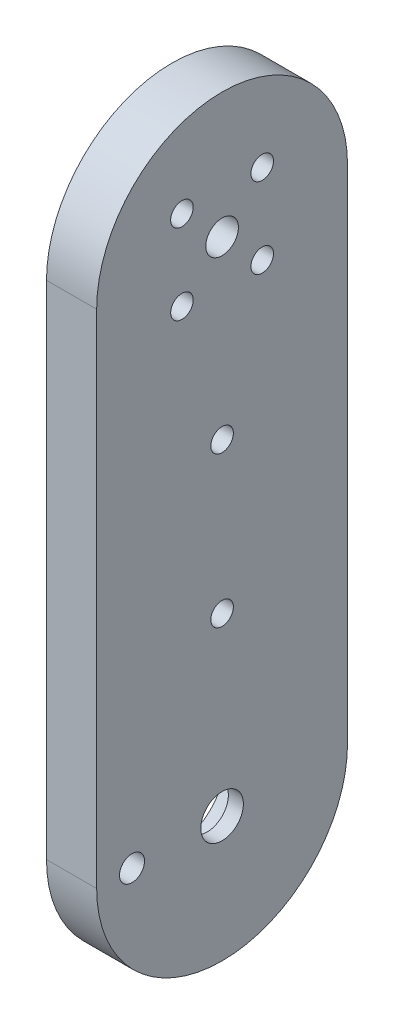
ISO-10303-21;
HEADER;
FILE_DESCRIPTION(('STEP AP214'),'2;1');
FILE_NAME('part.step','',(''),(''),'','','');
FILE_SCHEMA(('AUTOMOTIVE_DESIGN { 1 0 10303 214 1 1 1 1 }'));
ENDSEC;
DATA;
#1=APPLICATION_CONTEXT('core data for automotive mechanical design processes');
#2=APPLICATION_PROTOCOL_DEFINITION('international standard','automotive_design',2000,#1);
#3=PRODUCT_CONTEXT('',#1,'mechanical');
#4=PRODUCT('Part','Part','',(#3));
#5=PRODUCT_RELATED_PRODUCT_CATEGORY('part','',(#4));
#6=PRODUCT_DEFINITION_FORMATION('','',#4);
#7=PRODUCT_DEFINITION_CONTEXT('part definition',#1,'design');
#8=PRODUCT_DEFINITION('design','',#6,#7);
#9=PRODUCT_DEFINITION_SHAPE('','',#8);
#10=(LENGTH_UNIT() NAMED_UNIT(*) SI_UNIT(.MILLI.,.METRE.));
#11=(NAMED_UNIT(*) PLANE_ANGLE_UNIT() SI_UNIT($,.RADIAN.));
#12=(NAMED_UNIT(*) SI_UNIT($,.STERADIAN.) SOLID_ANGLE_UNIT());
#13=UNCERTAINTY_MEASURE_WITH_UNIT(LENGTH_MEASURE(1.E-05),#10,'distance_accuracy_value','');
#14=(GEOMETRIC_REPRESENTATION_CONTEXT(3) GLOBAL_UNCERTAINTY_ASSIGNED_CONTEXT((#13)) GLOBAL_UNIT_ASSIGNED_CONTEXT((#10,
#11,#12)) REPRESENTATION_CONTEXT('',''));
#15=CARTESIAN_POINT('',(0.,0.,0.));
#16=DIRECTION('',(0.,0.,1.));
#17=DIRECTION('',(1.,0.,0.));
#18=AXIS2_PLACEMENT_3D('',#15,#16,#17);
#19=CARTESIAN_POINT('',(10.,0.,0.));
#20=DIRECTION('',(1.,0.,0.));
#21=DIRECTION('',(0.,0.,-1.));
#22=AXIS2_PLACEMENT_3D('',#19,#20,#21);
#23=PLANE('',#22);
#24=CARTESIAN_POINT('',(10.,-100.,17.95));
#25=DIRECTION('',(-1.,0.,0.));
#26=DIRECTION('',(0.,0.,1.));
#27=AXIS2_PLACEMENT_3D('',#24,#25,#26);
#28=CIRCLE('',#27,2.5);
#29=CARTESIAN_POINT('',(10.,-100.,20.45));
#30=VERTEX_POINT('',#29);
#31=EDGE_CURVE('E217',#30,#30,#28,.T.);
#32=ORIENTED_EDGE('',*,*,#31,.T.);
#33=EDGE_LOOP('',(#32));
#34=FACE_BOUND('',#33,.T.);
#35=CARTESIAN_POINT('',(10.,-100.,0.));
#36=DIRECTION('',(-1.,0.,0.));
#37=DIRECTION('',(0.,0.,1.));
#38=AXIS2_PLACEMENT_3D('',#35,#36,#37);
#39=CIRCLE('',#38,4.25);
#40=CARTESIAN_POINT('',(10.,-100.,4.24999999999999));
#41=VERTEX_POINT('',#40);
#42=EDGE_CURVE('E225',#41,#41,#39,.T.);
#43=ORIENTED_EDGE('',*,*,#42,.T.);
#44=EDGE_LOOP('',(#43));
#45=FACE_BOUND('',#44,.T.);
#46=CARTESIAN_POINT('',(10.,-35.,0.));
#47=DIRECTION('',(-1.,0.,0.));
#48=DIRECTION('',(0.,0.,1.));
#49=AXIS2_PLACEMENT_3D('',#46,#47,#48);
#50=CIRCLE('',#49,2.25);
#51=CARTESIAN_POINT('',(10.,-35.,2.25));
#52=VERTEX_POINT('',#51);
#53=EDGE_CURVE('E99',#52,#52,#50,.T.);
#54=ORIENTED_EDGE('',*,*,#53,.T.);
#55=EDGE_LOOP('',(#54));
#56=FACE_BOUND('',#55,.T.);
#57=CARTESIAN_POINT('',(10.,-65.,0.));
#58=DIRECTION('',(-1.,0.,0.));
#59=DIRECTION('',(0.,0.,1.));
#60=AXIS2_PLACEMENT_3D('',#57,#58,#59);
#61=CIRCLE('',#60,2.25);
#62=CARTESIAN_POINT('',(10.,-65.,2.25));
#63=VERTEX_POINT('',#62);
#64=EDGE_CURVE('E234',#63,#63,#61,.T.);
#65=ORIENTED_EDGE('',*,*,#64,.T.);
#66=EDGE_LOOP('',(#65));
#67=FACE_BOUND('',#66,.T.);
#68=CARTESIAN_POINT('',(10.,-8.,-7.99999999999999));
#69=DIRECTION('',(1.,0.,0.));
#70=DIRECTION('',(0.,0.,-1.));
#71=AXIS2_PLACEMENT_3D('',#68,#69,#70);
#72=CIRCLE('',#71,2.25);
#73=CARTESIAN_POINT('',(10.,-8.,-10.25));
#74=VERTEX_POINT('',#73);
#75=EDGE_CURVE('E115',#74,#74,#72,.T.);
#76=ORIENTED_EDGE('',*,*,#75,.F.);
#77=EDGE_LOOP('',(#76));
#78=FACE_BOUND('',#77,.T.);
#79=CARTESIAN_POINT('',(10.,8.,8.00000000000001));
#80=DIRECTION('',(1.,0.,0.));
#81=DIRECTION('',(0.,0.,-1.));
#82=AXIS2_PLACEMENT_3D('',#79,#80,#81);
#83=CIRCLE('',#82,2.25);
#84=CARTESIAN_POINT('',(10.,8.,5.75000000000001));
#85=VERTEX_POINT('',#84);
#86=EDGE_CURVE('E127',#85,#85,#83,.T.);
#87=ORIENTED_EDGE('',*,*,#86,.F.);
#88=EDGE_LOOP('',(#87));
#89=FACE_BOUND('',#88,.T.);
#90=CARTESIAN_POINT('',(10.,0.,0.));
#91=DIRECTION('',(1.,0.,0.));
#92=DIRECTION('',(0.,0.,-1.));
#93=AXIS2_PLACEMENT_3D('',#90,#91,#92);
#94=CIRCLE('',#93,25.);
#95=CARTESIAN_POINT('',(10.,0.,-25.));
#96=VERTEX_POINT('',#95);
#97=CARTESIAN_POINT('',(10.,0.,25.));
#98=VERTEX_POINT('',#97);
#99=EDGE_CURVE('E139',#96,#98,#94,.T.);
#100=ORIENTED_EDGE('',*,*,#99,.T.);
#101=DIRECTION('',(0.,-1.,0.));
#102=VECTOR('',#101,1.);
#103=CARTESIAN_POINT('',(10.,0.,25.));
#104=LINE('',#103,#102);
#105=CARTESIAN_POINT('',(10.,-100.,25.));
#106=VERTEX_POINT('',#105);
#107=EDGE_CURVE('E87',#98,#106,#104,.T.);
#108=ORIENTED_EDGE('',*,*,#107,.T.);
#109=CARTESIAN_POINT('',(10.,-100.,0.));
#110=DIRECTION('',(1.,0.,0.));
#111=DIRECTION('',(0.,0.,-1.));
#112=AXIS2_PLACEMENT_3D('',#109,#110,#111);
#113=CIRCLE('',#112,25.);
#114=CARTESIAN_POINT('',(10.,-100.,-25.));
#115=VERTEX_POINT('',#114);
#116=EDGE_CURVE('E94',#106,#115,#113,.T.);
#117=ORIENTED_EDGE('',*,*,#116,.T.);
#118=DIRECTION('',(0.,1.,0.));
#119=VECTOR('',#118,1.);
#120=CARTESIAN_POINT('',(10.,-85.,-25.));
#121=LINE('',#120,#119);
#122=EDGE_CURVE('E56',#115,#96,#121,.T.);
#123=ORIENTED_EDGE('',*,*,#122,.T.);
#124=EDGE_LOOP('',(#100,#108,#117,#123));
#125=FACE_BOUND('',#124,.T.);
#126=CARTESIAN_POINT('',(10.,0.,0.));
#127=DIRECTION('',(1.,0.,0.));
#128=DIRECTION('',(0.,0.,-1.));
#129=AXIS2_PLACEMENT_3D('',#126,#127,#128);
#130=CIRCLE('',#129,3.25);
#131=CARTESIAN_POINT('',(10.,0.,-3.25));
#132=VERTEX_POINT('',#131);
#133=EDGE_CURVE('E133',#132,#132,#130,.T.);
#134=ORIENTED_EDGE('',*,*,#133,.F.);
#135=EDGE_LOOP('',(#134));
#136=FACE_BOUND('',#135,.T.);
#137=CARTESIAN_POINT('',(10.,8.,-7.99999999999999));
#138=DIRECTION('',(1.,0.,0.));
#139=DIRECTION('',(0.,0.,-1.));
#140=AXIS2_PLACEMENT_3D('',#137,#138,#139);
#141=CIRCLE('',#140,2.25);
#142=CARTESIAN_POINT('',(10.,8.,-10.25));
#143=VERTEX_POINT('',#142);
#144=EDGE_CURVE('E121',#143,#143,#141,.T.);
#145=ORIENTED_EDGE('',*,*,#144,.F.);
#146=EDGE_LOOP('',(#145));
#147=FACE_BOUND('',#146,.T.);
#148=CARTESIAN_POINT('',(10.,-8.,8.00000000000001));
#149=DIRECTION('',(1.,0.,0.));
#150=DIRECTION('',(0.,0.,-1.));
#151=AXIS2_PLACEMENT_3D('',#148,#149,#150);
#152=CIRCLE('',#151,2.25);
#153=CARTESIAN_POINT('',(10.,-8.,5.75000000000001));
#154=VERTEX_POINT('',#153);
#155=EDGE_CURVE('E108',#154,#154,#152,.T.);
#156=ORIENTED_EDGE('',*,*,#155,.F.);
#157=EDGE_LOOP('',(#156));
#158=FACE_BOUND('',#157,.T.);
#159=ADVANCED_FACE('F39',(#34,#45,#56,#67,#78,#89,#125,#136,#147,#158),#23,.T.);
#160=CARTESIAN_POINT('',(0.,0.,0.));
#161=DIRECTION('',(1.,0.,0.));
#162=DIRECTION('',(0.,0.,-1.));
#163=AXIS2_PLACEMENT_3D('',#160,#161,#162);
#164=PLANE('',#163);
#165=CARTESIAN_POINT('',(0.,-100.,17.95));
#166=DIRECTION('',(-1.,0.,0.));
#167=DIRECTION('',(0.,0.,1.));
#168=AXIS2_PLACEMENT_3D('',#165,#166,#167);
#169=CIRCLE('',#168,2.5);
#170=CARTESIAN_POINT('',(0.,-100.,20.45));
#171=VERTEX_POINT('',#170);
#172=EDGE_CURVE('E220',#171,#171,#169,.T.);
#173=ORIENTED_EDGE('',*,*,#172,.F.);
#174=EDGE_LOOP('',(#173));
#175=FACE_BOUND('',#174,.T.);
#176=CARTESIAN_POINT('',(0.,-100.,0.));
#177=DIRECTION('',(-1.,0.,0.));
#178=DIRECTION('',(0.,0.,1.));
#179=AXIS2_PLACEMENT_3D('',#176,#177,#178);
#180=CIRCLE('',#179,10.9);
#181=CARTESIAN_POINT('',(0.,-100.,10.9));
#182=VERTEX_POINT('',#181);
#183=EDGE_CURVE('E228',#182,#182,#180,.T.);
#184=ORIENTED_EDGE('',*,*,#183,.F.);
#185=EDGE_LOOP('',(#184));
#186=FACE_BOUND('',#185,.T.);
#187=CARTESIAN_POINT('',(0.,-35.,0.));
#188=DIRECTION('',(-1.,0.,0.));
#189=DIRECTION('',(0.,0.,1.));
#190=AXIS2_PLACEMENT_3D('',#187,#188,#189);
#191=CIRCLE('',#190,2.25);
#192=CARTESIAN_POINT('',(0.,-35.,2.25));
#193=VERTEX_POINT('',#192);
#194=EDGE_CURVE('E102',#193,#193,#191,.T.);
#195=ORIENTED_EDGE('',*,*,#194,.F.);
#196=EDGE_LOOP('',(#195));
#197=FACE_BOUND('',#196,.T.);
#198=CARTESIAN_POINT('',(0.,-65.,0.));
#199=DIRECTION('',(-1.,0.,0.));
#200=DIRECTION('',(0.,0.,1.));
#201=AXIS2_PLACEMENT_3D('',#198,#199,#200);
#202=CIRCLE('',#201,2.25);
#203=CARTESIAN_POINT('',(0.,-65.,2.25));
#204=VERTEX_POINT('',#203);
#205=EDGE_CURVE('E239',#204,#204,#202,.T.);
#206=ORIENTED_EDGE('',*,*,#205,.F.);
#207=EDGE_LOOP('',(#206));
#208=FACE_BOUND('',#207,.T.);
#209=CARTESIAN_POINT('',(0.,0.,0.));
#210=DIRECTION('',(1.,0.,0.));
#211=DIRECTION('',(0.,0.,-1.));
#212=AXIS2_PLACEMENT_3D('',#209,#210,#211);
#213=CIRCLE('',#212,25.);
#214=CARTESIAN_POINT('',(0.,0.,-25.));
#215=VERTEX_POINT('',#214);
#216=CARTESIAN_POINT('',(0.,0.,25.));
#217=VERTEX_POINT('',#216);
#218=EDGE_CURVE('E136',#215,#217,#213,.T.);
#219=ORIENTED_EDGE('',*,*,#218,.F.);
#220=DIRECTION('',(0.,1.,0.));
#221=VECTOR('',#220,1.);
#222=CARTESIAN_POINT('',(0.,-85.,-25.));
#223=LINE('',#222,#221);
#224=CARTESIAN_POINT('',(0.,-100.,-25.));
#225=VERTEX_POINT('',#224);
#226=EDGE_CURVE('E141',#225,#215,#223,.T.);
#227=ORIENTED_EDGE('',*,*,#226,.F.);
#228=CARTESIAN_POINT('',(0.,-100.,0.));
#229=DIRECTION('',(1.,0.,0.));
#230=DIRECTION('',(0.,0.,-1.));
#231=AXIS2_PLACEMENT_3D('',#228,#229,#230);
#232=CIRCLE('',#231,25.);
#233=CARTESIAN_POINT('',(0.,-100.,25.));
#234=VERTEX_POINT('',#233);
#235=EDGE_CURVE('E95',#225,#234,#232,.F.);
#236=ORIENTED_EDGE('',*,*,#235,.T.);
#237=DIRECTION('',(0.,-1.,0.));
#238=VECTOR('',#237,1.);
#239=CARTESIAN_POINT('',(0.,0.,25.));
#240=LINE('',#239,#238);
#241=EDGE_CURVE('E68',#217,#234,#240,.T.);
#242=ORIENTED_EDGE('',*,*,#241,.F.);
#243=EDGE_LOOP('',(#219,#227,#236,#242));
#244=FACE_BOUND('',#243,.T.);
#245=CARTESIAN_POINT('',(0.,0.,0.));
#246=DIRECTION('',(1.,0.,0.));
#247=DIRECTION('',(0.,0.,-1.));
#248=AXIS2_PLACEMENT_3D('',#245,#246,#247);
#249=CIRCLE('',#248,3.25);
#250=CARTESIAN_POINT('',(0.,0.,-3.25));
#251=VERTEX_POINT('',#250);
#252=EDGE_CURVE('E130',#251,#251,#249,.T.);
#253=ORIENTED_EDGE('',*,*,#252,.T.);
#254=EDGE_LOOP('',(#253));
#255=FACE_BOUND('',#254,.T.);
#256=CARTESIAN_POINT('',(0.,8.,8.00000000000001));
#257=DIRECTION('',(1.,0.,0.));
#258=DIRECTION('',(0.,0.,-1.));
#259=AXIS2_PLACEMENT_3D('',#256,#257,#258);
#260=CIRCLE('',#259,2.25);
#261=CARTESIAN_POINT('',(0.,8.,5.75000000000001));
#262=VERTEX_POINT('',#261);
#263=EDGE_CURVE('E124',#262,#262,#260,.T.);
#264=ORIENTED_EDGE('',*,*,#263,.T.);
#265=EDGE_LOOP('',(#264));
#266=FACE_BOUND('',#265,.T.);
#267=CARTESIAN_POINT('',(0.,8.,-7.99999999999999));
#268=DIRECTION('',(1.,0.,0.));
#269=DIRECTION('',(0.,0.,-1.));
#270=AXIS2_PLACEMENT_3D('',#267,#268,#269);
#271=CIRCLE('',#270,2.25);
#272=CARTESIAN_POINT('',(0.,8.,-10.25));
#273=VERTEX_POINT('',#272);
#274=EDGE_CURVE('E118',#273,#273,#271,.T.);
#275=ORIENTED_EDGE('',*,*,#274,.T.);
#276=EDGE_LOOP('',(#275));
#277=FACE_BOUND('',#276,.T.);
#278=CARTESIAN_POINT('',(0.,-8.,-7.99999999999999));
#279=DIRECTION('',(1.,0.,0.));
#280=DIRECTION('',(0.,0.,-1.));
#281=AXIS2_PLACEMENT_3D('',#278,#279,#280);
#282=CIRCLE('',#281,2.25);
#283=CARTESIAN_POINT('',(0.,-8.,-10.25));
#284=VERTEX_POINT('',#283);
#285=EDGE_CURVE('E111',#284,#284,#282,.T.);
#286=ORIENTED_EDGE('',*,*,#285,.T.);
#287=EDGE_LOOP('',(#286));
#288=FACE_BOUND('',#287,.T.);
#289=CARTESIAN_POINT('',(0.,-8.,8.00000000000001));
#290=DIRECTION('',(1.,0.,0.));
#291=DIRECTION('',(0.,0.,-1.));
#292=AXIS2_PLACEMENT_3D('',#289,#290,#291);
#293=CIRCLE('',#292,2.25);
#294=CARTESIAN_POINT('',(0.,-8.,5.75000000000001));
#295=VERTEX_POINT('',#294);
#296=EDGE_CURVE('E112',#295,#295,#293,.T.);
#297=ORIENTED_EDGE('',*,*,#296,.T.);
#298=EDGE_LOOP('',(#297));
#299=FACE_BOUND('',#298,.T.);
#300=ADVANCED_FACE('F148',(#175,#186,#197,#208,#244,#255,#266,#277,#288,#299),#164,.F.);
#301=CARTESIAN_POINT('',(10.,0.,0.));
#302=DIRECTION('',(-1.,0.,0.));
#303=DIRECTION('',(0.,0.,1.));
#304=AXIS2_PLACEMENT_3D('',#301,#302,#303);
#305=CYLINDRICAL_SURFACE('',#304,25.);
#306=ORIENTED_EDGE('',*,*,#218,.T.);
#307=DIRECTION('',(-1.,0.,0.));
#308=VECTOR('',#307,1.);
#309=CARTESIAN_POINT('',(10.,0.,25.));
#310=LINE('',#309,#308);
#311=EDGE_CURVE('E11',#98,#217,#310,.T.);
#312=ORIENTED_EDGE('',*,*,#311,.F.);
#313=ORIENTED_EDGE('',*,*,#99,.F.);
#314=DIRECTION('',(-1.,0.,0.));
#315=VECTOR('',#314,1.);
#316=CARTESIAN_POINT('',(10.,0.,-25.));
#317=LINE('',#316,#315);
#318=EDGE_CURVE('E48',#96,#215,#317,.T.);
#319=ORIENTED_EDGE('',*,*,#318,.T.);
#320=EDGE_LOOP('',(#306,#312,#313,#319));
#321=FACE_BOUND('',#320,.T.);
#322=ADVANCED_FACE('F41',(#321),#305,.T.);
#323=CARTESIAN_POINT('',(10.,0.,25.));
#324=DIRECTION('',(0.,0.,-1.));
#325=DIRECTION('',(0.,1.,0.));
#326=AXIS2_PLACEMENT_3D('',#323,#324,#325);
#327=PLANE('',#326);
#328=ORIENTED_EDGE('',*,*,#241,.T.);
#329=DIRECTION('',(1.,0.,0.));
#330=VECTOR('',#329,1.);
#331=CARTESIAN_POINT('',(-64.0312423743285,-100.,25.));
#332=LINE('',#331,#330);
#333=EDGE_CURVE('E96',#234,#106,#332,.T.);
#334=ORIENTED_EDGE('',*,*,#333,.T.);
#335=ORIENTED_EDGE('',*,*,#107,.F.);
#336=ORIENTED_EDGE('',*,*,#311,.T.);
#337=EDGE_LOOP('',(#328,#334,#335,#336));
#338=FACE_BOUND('',#337,.T.);
#339=ADVANCED_FACE('F150',(#338),#327,.F.);
#340=CARTESIAN_POINT('',(10.,-85.,-25.));
#341=DIRECTION('',(0.,0.,1.));
#342=DIRECTION('',(0.,-1.,0.));
#343=AXIS2_PLACEMENT_3D('',#340,#341,#342);
#344=PLANE('',#343);
#345=ORIENTED_EDGE('',*,*,#226,.T.);
#346=ORIENTED_EDGE('',*,*,#318,.F.);
#347=ORIENTED_EDGE('',*,*,#122,.F.);
#348=DIRECTION('',(1.,0.,0.));
#349=VECTOR('',#348,1.);
#350=CARTESIAN_POINT('',(-64.0312423743285,-100.,-25.));
#351=LINE('',#350,#349);
#352=EDGE_CURVE('E84',#225,#115,#351,.T.);
#353=ORIENTED_EDGE('',*,*,#352,.F.);
#354=EDGE_LOOP('',(#345,#346,#347,#353));
#355=FACE_BOUND('',#354,.T.);
#356=ADVANCED_FACE('F83',(#355),#344,.F.);
#357=CARTESIAN_POINT('',(10.,0.,0.));
#358=DIRECTION('',(-1.,0.,0.));
#359=DIRECTION('',(0.,0.,1.));
#360=AXIS2_PLACEMENT_3D('',#357,#358,#359);
#361=CYLINDRICAL_SURFACE('',#360,3.25);
#362=ORIENTED_EDGE('',*,*,#133,.T.);
#363=EDGE_LOOP('',(#362));
#364=FACE_BOUND('',#363,.T.);
#365=ORIENTED_EDGE('',*,*,#252,.F.);
#366=EDGE_LOOP('',(#365));
#367=FACE_BOUND('',#366,.T.);
#368=ADVANCED_FACE('F156',(#364,#367),#361,.F.);
#369=CARTESIAN_POINT('',(10.,8.,8.00000000000001));
#370=DIRECTION('',(-1.,0.,0.));
#371=DIRECTION('',(0.,0.,1.));
#372=AXIS2_PLACEMENT_3D('',#369,#370,#371);
#373=CYLINDRICAL_SURFACE('',#372,2.25);
#374=ORIENTED_EDGE('',*,*,#86,.T.);
#375=EDGE_LOOP('',(#374));
#376=FACE_BOUND('',#375,.T.);
#377=ORIENTED_EDGE('',*,*,#263,.F.);
#378=EDGE_LOOP('',(#377));
#379=FACE_BOUND('',#378,.T.);
#380=ADVANCED_FACE('F173',(#376,#379),#373,.F.);
#381=CARTESIAN_POINT('',(10.,8.,-7.99999999999999));
#382=DIRECTION('',(-1.,0.,0.));
#383=DIRECTION('',(0.,0.,1.));
#384=AXIS2_PLACEMENT_3D('',#381,#382,#383);
#385=CYLINDRICAL_SURFACE('',#384,2.25);
#386=ORIENTED_EDGE('',*,*,#144,.T.);
#387=EDGE_LOOP('',(#386));
#388=FACE_BOUND('',#387,.T.);
#389=ORIENTED_EDGE('',*,*,#274,.F.);
#390=EDGE_LOOP('',(#389));
#391=FACE_BOUND('',#390,.T.);
#392=ADVANCED_FACE('F177',(#388,#391),#385,.F.);
#393=CARTESIAN_POINT('',(10.,-8.,-7.99999999999999));
#394=DIRECTION('',(-1.,0.,0.));
#395=DIRECTION('',(0.,0.,1.));
#396=AXIS2_PLACEMENT_3D('',#393,#394,#395);
#397=CYLINDRICAL_SURFACE('',#396,2.25);
#398=ORIENTED_EDGE('',*,*,#75,.T.);
#399=EDGE_LOOP('',(#398));
#400=FACE_BOUND('',#399,.T.);
#401=ORIENTED_EDGE('',*,*,#285,.F.);
#402=EDGE_LOOP('',(#401));
#403=FACE_BOUND('',#402,.T.);
#404=ADVANCED_FACE('F181',(#400,#403),#397,.F.);
#405=CARTESIAN_POINT('',(10.,-8.,8.00000000000001));
#406=DIRECTION('',(-1.,0.,0.));
#407=DIRECTION('',(0.,0.,1.));
#408=AXIS2_PLACEMENT_3D('',#405,#406,#407);
#409=CYLINDRICAL_SURFACE('',#408,2.25);
#410=ORIENTED_EDGE('',*,*,#155,.T.);
#411=EDGE_LOOP('',(#410));
#412=FACE_BOUND('',#411,.T.);
#413=ORIENTED_EDGE('',*,*,#296,.F.);
#414=EDGE_LOOP('',(#413));
#415=FACE_BOUND('',#414,.T.);
#416=ADVANCED_FACE('F185',(#412,#415),#409,.F.);
#417=CARTESIAN_POINT('',(-64.0312423743285,-100.,0.));
#418=DIRECTION('',(1.,0.,0.));
#419=DIRECTION('',(0.,0.,-1.));
#420=AXIS2_PLACEMENT_3D('',#417,#418,#419);
#421=CYLINDRICAL_SURFACE('',#420,25.);
#422=ORIENTED_EDGE('',*,*,#235,.F.);
#423=ORIENTED_EDGE('',*,*,#352,.T.);
#424=ORIENTED_EDGE('',*,*,#116,.F.);
#425=ORIENTED_EDGE('',*,*,#333,.F.);
#426=EDGE_LOOP('',(#422,#423,#424,#425));
#427=FACE_BOUND('',#426,.T.);
#428=ADVANCED_FACE('F92',(#427),#421,.T.);
#429=CARTESIAN_POINT('',(10.,-65.,0.));
#430=DIRECTION('',(-1.,0.,0.));
#431=DIRECTION('',(0.,0.,1.));
#432=AXIS2_PLACEMENT_3D('',#429,#430,#431);
#433=CYLINDRICAL_SURFACE('',#432,2.25);
#434=ORIENTED_EDGE('',*,*,#64,.F.);
#435=EDGE_LOOP('',(#434));
#436=FACE_BOUND('',#435,.T.);
#437=ORIENTED_EDGE('',*,*,#205,.T.);
#438=EDGE_LOOP('',(#437));
#439=FACE_BOUND('',#438,.T.);
#440=ADVANCED_FACE('F191',(#436,#439),#433,.F.);
#441=CARTESIAN_POINT('',(10.,-35.,0.));
#442=DIRECTION('',(-1.,0.,0.));
#443=DIRECTION('',(0.,0.,1.));
#444=AXIS2_PLACEMENT_3D('',#441,#442,#443);
#445=CYLINDRICAL_SURFACE('',#444,2.25);
#446=ORIENTED_EDGE('',*,*,#53,.F.);
#447=EDGE_LOOP('',(#446));
#448=FACE_BOUND('',#447,.T.);
#449=ORIENTED_EDGE('',*,*,#194,.T.);
#450=EDGE_LOOP('',(#449));
#451=FACE_BOUND('',#450,.T.);
#452=ADVANCED_FACE('F194',(#448,#451),#445,.F.);
#453=CARTESIAN_POINT('',(7.,-100.,0.));
#454=DIRECTION('',(-1.,0.,0.));
#455=DIRECTION('',(0.,0.,1.));
#456=AXIS2_PLACEMENT_3D('',#453,#454,#455);
#457=CYLINDRICAL_SURFACE('',#456,10.9);
#458=CARTESIAN_POINT('',(7.,-100.,0.));
#459=DIRECTION('',(-1.,0.,0.));
#460=DIRECTION('',(0.,0.,1.));
#461=AXIS2_PLACEMENT_3D('',#458,#459,#460);
#462=CIRCLE('',#461,10.9);
#463=CARTESIAN_POINT('',(7.,-100.,10.9));
#464=VERTEX_POINT('',#463);
#465=EDGE_CURVE('E231',#464,#464,#462,.T.);
#466=ORIENTED_EDGE('',*,*,#465,.F.);
#467=EDGE_LOOP('',(#466));
#468=FACE_BOUND('',#467,.T.);
#469=ORIENTED_EDGE('',*,*,#183,.T.);
#470=EDGE_LOOP('',(#469));
#471=FACE_BOUND('',#470,.T.);
#472=ADVANCED_FACE('F198',(#468,#471),#457,.F.);
#473=CARTESIAN_POINT('',(7.,-100.,0.));
#474=DIRECTION('',(-1.,0.,0.));
#475=DIRECTION('',(0.,0.,1.));
#476=AXIS2_PLACEMENT_3D('',#473,#474,#475);
#477=PLANE('',#476);
#478=CARTESIAN_POINT('',(7.,-100.,0.));
#479=DIRECTION('',(-1.,0.,0.));
#480=DIRECTION('',(0.,0.,1.));
#481=AXIS2_PLACEMENT_3D('',#478,#479,#480);
#482=CIRCLE('',#481,4.25);
#483=CARTESIAN_POINT('',(7.,-100.,4.24999999999999));
#484=VERTEX_POINT('',#483);
#485=EDGE_CURVE('E222',#484,#484,#482,.T.);
#486=ORIENTED_EDGE('',*,*,#485,.F.);
#487=EDGE_LOOP('',(#486));
#488=FACE_BOUND('',#487,.T.);
#489=ORIENTED_EDGE('',*,*,#465,.T.);
#490=EDGE_LOOP('',(#489));
#491=FACE_BOUND('',#490,.T.);
#492=ADVANCED_FACE('F202',(#488,#491),#477,.T.);
#493=CARTESIAN_POINT('',(10.,-100.,0.));
#494=DIRECTION('',(-1.,0.,0.));
#495=DIRECTION('',(0.,0.,1.));
#496=AXIS2_PLACEMENT_3D('',#493,#494,#495);
#497=CYLINDRICAL_SURFACE('',#496,4.25);
#498=ORIENTED_EDGE('',*,*,#42,.F.);
#499=EDGE_LOOP('',(#498));
#500=FACE_BOUND('',#499,.T.);
#501=ORIENTED_EDGE('',*,*,#485,.T.);
#502=EDGE_LOOP('',(#501));
#503=FACE_BOUND('',#502,.T.);
#504=ADVANCED_FACE('F206',(#500,#503),#497,.F.);
#505=CARTESIAN_POINT('',(10.,-100.,17.95));
#506=DIRECTION('',(-1.,0.,0.));
#507=DIRECTION('',(0.,0.,1.));
#508=AXIS2_PLACEMENT_3D('',#505,#506,#507);
#509=CYLINDRICAL_SURFACE('',#508,2.5);
#510=ORIENTED_EDGE('',*,*,#31,.F.);
#511=EDGE_LOOP('',(#510));
#512=FACE_BOUND('',#511,.T.);
#513=ORIENTED_EDGE('',*,*,#172,.T.);
#514=EDGE_LOOP('',(#513));
#515=FACE_BOUND('',#514,.T.);
#516=ADVANCED_FACE('F209',(#512,#515),#509,.F.);
#517=CLOSED_SHELL('',(#159,#300,#322,#339,#356,#368,#380,#392,#404,#416,#428,#440,#452,#472,
#492,#504,#516));
#518=MANIFOLD_SOLID_BREP('B2',#517);
#519=ADVANCED_BREP_SHAPE_REPRESENTATION('',(#18,#518),#14);
#520=SHAPE_DEFINITION_REPRESENTATION(#9,#519);
ENDSEC;
END-ISO-10303-21;
